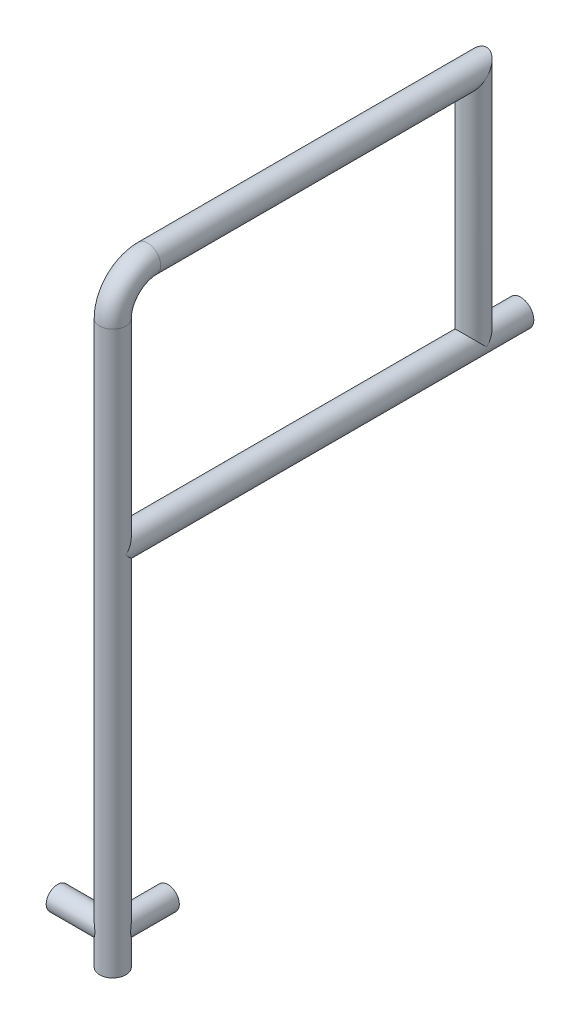
ISO-10303-21;
HEADER;
FILE_DESCRIPTION(('STEP AP214'),'2;1');
FILE_NAME('part.step','',(''),(''),'','','');
FILE_SCHEMA(('AUTOMOTIVE_DESIGN { 1 0 10303 214 1 1 1 1 }'));
ENDSEC;
DATA;
#1=APPLICATION_CONTEXT('core data for automotive mechanical design processes');
#2=APPLICATION_PROTOCOL_DEFINITION('international standard','automotive_design',2000,#1);
#3=PRODUCT_CONTEXT('',#1,'mechanical');
#4=PRODUCT('Part','Part','',(#3));
#5=PRODUCT_RELATED_PRODUCT_CATEGORY('part','',(#4));
#6=PRODUCT_DEFINITION_FORMATION('','',#4);
#7=PRODUCT_DEFINITION_CONTEXT('part definition',#1,'design');
#8=PRODUCT_DEFINITION('design','',#6,#7);
#9=PRODUCT_DEFINITION_SHAPE('','',#8);
#10=(LENGTH_UNIT() NAMED_UNIT(*) SI_UNIT(.MILLI.,.METRE.));
#11=(NAMED_UNIT(*) PLANE_ANGLE_UNIT() SI_UNIT($,.RADIAN.));
#12=(NAMED_UNIT(*) SI_UNIT($,.STERADIAN.) SOLID_ANGLE_UNIT());
#13=UNCERTAINTY_MEASURE_WITH_UNIT(LENGTH_MEASURE(1.E-05),#10,'distance_accuracy_value','');
#14=(GEOMETRIC_REPRESENTATION_CONTEXT(3) GLOBAL_UNCERTAINTY_ASSIGNED_CONTEXT((#13)) GLOBAL_UNIT_ASSIGNED_CONTEXT((#10,
#11,#12)) REPRESENTATION_CONTEXT('',''));
#15=CARTESIAN_POINT('',(0.,0.,0.));
#16=DIRECTION('',(0.,0.,1.));
#17=DIRECTION('',(1.,0.,0.));
#18=AXIS2_PLACEMENT_3D('',#15,#16,#17);
#19=CARTESIAN_POINT('',(0.,378.064321521951,-550.094321521951));
#20=DIRECTION('',(0.,-1.,0.));
#21=DIRECTION('',(0.,0.,-1.));
#22=AXIS2_PLACEMENT_3D('',#19,#20,#21);
#23=CYLINDRICAL_SURFACE('',#22,20.);
#24=CARTESIAN_POINT('',(0.,0.,-550.094321521951));
#25=DIRECTION('',(0.,-0.707106781186548,0.707106781186547));
#26=DIRECTION('',(0.,-0.707106781186547,-0.707106781186548));
#27=AXIS2_PLACEMENT_3D('',#24,#25,#26);
#28=ELLIPSE('',#27,28.2842712474619,20.);
#29=CARTESIAN_POINT('',(19.9997775850257,0.0943215219507132,-550.));
#30=VERTEX_POINT('',#29);
#31=CARTESIAN_POINT('',(-19.9997775850257,0.0943215219507132,-550.));
#32=VERTEX_POINT('',#31);
#33=EDGE_CURVE('E137',#30,#32,#28,.T.);
#34=ORIENTED_EDGE('',*,*,#33,.F.);
#35=DIRECTION('',(0.,0.,1.));
#36=VECTOR('',#35,1.);
#37=CARTESIAN_POINT('',(19.9997775850257,0.0943215219507415,-622.));
#38=LINE('',#37,#36);
#39=CARTESIAN_POINT('',(19.9997775850257,0.0943215219507132,-550.188643043902));
#40=VERTEX_POINT('',#39);
#41=EDGE_CURVE('E132',#40,#30,#38,.T.);
#42=ORIENTED_EDGE('',*,*,#41,.F.);
#43=CARTESIAN_POINT('',(0.,0.,-550.094321521951));
#44=DIRECTION('',(0.,-0.707106781186547,-0.707106781186548));
#45=DIRECTION('',(0.,-0.707106781186548,0.707106781186547));
#46=AXIS2_PLACEMENT_3D('',#43,#44,#45);
#47=ELLIPSE('',#46,28.2842712474619,20.);
#48=CARTESIAN_POINT('',(-19.9997775850257,0.0943215219507132,-550.188643043902));
#49=VERTEX_POINT('',#48);
#50=EDGE_CURVE('E64',#49,#40,#47,.T.);
#51=ORIENTED_EDGE('',*,*,#50,.F.);
#52=DIRECTION('',(0.,0.,1.));
#53=VECTOR('',#52,1.);
#54=CARTESIAN_POINT('',(-19.9997775850257,0.0943215219507415,-622.));
#55=LINE('',#54,#53);
#56=EDGE_CURVE('E138',#32,#49,#55,.F.);
#57=ORIENTED_EDGE('',*,*,#56,.F.);
#58=EDGE_LOOP('',(#34,#42,#51,#57));
#59=FACE_BOUND('',#58,.T.);
#60=CARTESIAN_POINT('',(0.,355.964321521951,-550.094321521951));
#61=DIRECTION('',(0.,-0.707106781186547,-0.707106781186547));
#62=DIRECTION('',(0.,0.707106781186548,-0.707106781186548));
#63=AXIS2_PLACEMENT_3D('',#60,#61,#62);
#64=ELLIPSE('',#63,28.2842712474619,20.);
#65=CARTESIAN_POINT('',(0.,375.964321521951,-570.094321521951));
#66=VERTEX_POINT('',#65);
#67=EDGE_CURVE('E203',#66,#66,#64,.F.);
#68=ORIENTED_EDGE('',*,*,#67,.F.);
#69=EDGE_LOOP('',(#68));
#70=FACE_BOUND('',#69,.T.);
#71=ADVANCED_FACE('F43',(#59,#70),#23,.T.);
#72=CARTESIAN_POINT('',(0.,0.,0.));
#73=DIRECTION('',(0.,1.,0.));
#74=DIRECTION('',(0.,0.,1.));
#75=AXIS2_PLACEMENT_3D('',#72,#73,#74);
#76=CYLINDRICAL_SURFACE('',#75,20.);
#77=CARTESIAN_POINT('',(-9.68245836551853,-503.90605298,-17.5));
#78=CARTESIAN_POINT('',(-9.68246231795958,-504.187638009203,-17.4999987045085));
#79=CARTESIAN_POINT('',(-9.69480918943084,-504.469242415254,-17.493183750782));
#80=CARTESIAN_POINT('',(-9.74343813489293,-505.029712400521,-17.4661432014171));
#81=CARTESIAN_POINT('',(-9.77972336892798,-505.308577613209,-17.4459158352374));
#82=CARTESIAN_POINT('',(-9.87426328854648,-505.86197922257,-17.3925802335263));
#83=CARTESIAN_POINT('',(-9.93257330136768,-506.136502888467,-17.3594395524864));
#84=CARTESIAN_POINT('',(-10.0682929552098,-506.679066974342,-17.2810764516704));
#85=CARTESIAN_POINT('',(-10.1457112063541,-506.947104411692,-17.2358485846765));
#86=CARTESIAN_POINT('',(-10.3543761638166,-507.592997294864,-17.1116158332259));
#87=CARTESIAN_POINT('',(-10.4942738051237,-507.966884340313,-17.0265244282843));
#88=CARTESIAN_POINT('',(-10.7986160705714,-508.698873939867,-16.835147722142));
#89=CARTESIAN_POINT('',(-10.9630748290121,-509.05696725036,-16.7288502054552));
#90=CARTESIAN_POINT('',(-11.3099122851878,-509.759045089837,-16.4963517580476));
#91=CARTESIAN_POINT('',(-11.4923444346771,-510.102982941877,-16.3700907398646));
#92=CARTESIAN_POINT('',(-11.8691327091975,-510.776586977339,-16.0989927963247));
#93=CARTESIAN_POINT('',(-12.0634878401741,-511.106254346635,-15.9541574184724));
#94=CARTESIAN_POINT('',(-12.4192960222625,-511.686154489637,-15.6780399234265));
#95=CARTESIAN_POINT('',(-12.5793409858103,-511.938834657242,-15.5500516306426));
#96=CARTESIAN_POINT('',(-12.9025933017771,-512.43615073305,-15.2829019251943));
#97=CARTESIAN_POINT('',(-13.065800967815,-512.680785836935,-15.1437394001281));
#98=CARTESIAN_POINT('',(-13.5580665641397,-513.403209717864,-14.7095234796256));
#99=CARTESIAN_POINT('',(-13.8896847405041,-513.869385708831,-14.3978045379539));
#100=CARTESIAN_POINT('',(-14.5496844312408,-514.770531463886,-13.7305135891895));
#101=CARTESIAN_POINT('',(-14.878068960753,-515.205533269556,-13.3749876608545));
#102=CARTESIAN_POINT('',(-15.5240744357728,-516.043516244562,-12.6194286054934));
#103=CARTESIAN_POINT('',(-15.8417001432422,-516.446511689313,-12.2194155138144));
#104=CARTESIAN_POINT('',(-16.3876744815375,-517.128659549576,-11.471973798996));
#105=CARTESIAN_POINT('',(-16.619711347584,-517.41493070967,-11.1337109016367));
#106=CARTESIAN_POINT('',(-17.0698056319617,-517.964974479015,-10.4305290731242));
#107=CARTESIAN_POINT('',(-17.2878634246317,-518.22874769079,-10.0656108563211));
#108=CARTESIAN_POINT('',(-17.706227397409,-518.73102357124,-9.30998224050817));
#109=CARTESIAN_POINT('',(-17.9065576451303,-518.969560590409,-8.91930810724853));
#110=CARTESIAN_POINT('',(-18.2861816709093,-519.418914990599,-8.11259198784253));
#111=CARTESIAN_POINT('',(-18.4654796998659,-519.629737974048,-7.69655515376672));
#112=CARTESIAN_POINT('',(-18.7680937292758,-519.983930199969,-6.9208446503503));
#113=CARTESIAN_POINT('',(-18.8956068534805,-520.132539332453,-6.56519415452418));
#114=CARTESIAN_POINT('',(-19.1323128930904,-520.407577264458,-5.83953557962174));
#115=CARTESIAN_POINT('',(-19.2415095615515,-520.534010608058,-5.46953046099681));
#116=CARTESIAN_POINT('',(-19.4396771962977,-520.762930860696,-4.71701905550166));
#117=CARTESIAN_POINT('',(-19.5286551275903,-520.865426016367,-4.33451712566136));
#118=CARTESIAN_POINT('',(-19.6847333854608,-521.044918001859,-3.55916144167617));
#119=CARTESIAN_POINT('',(-19.7518334706815,-521.121914550378,-3.16630757337998));
#120=CARTESIAN_POINT('',(-19.8630552241249,-521.249407349046,-2.37089370722918));
#121=CARTESIAN_POINT('',(-19.9070523449014,-521.299759973523,-1.96829309755187));
#122=CARTESIAN_POINT('',(-19.9705396287186,-521.372385309669,-1.15863165139295));
#123=CARTESIAN_POINT('',(-19.9900297363705,-521.394657957872,-0.751570804832758));
#124=CARTESIAN_POINT('',(-20.0040514912821,-521.410683537615,0.0634815918555094));
#125=CARTESIAN_POINT('',(-19.9985868727677,-521.404440736207,0.471472993603273));
#126=CARTESIAN_POINT('',(-19.9628332349748,-521.36356740107,1.28491619288903));
#127=CARTESIAN_POINT('',(-19.9325455339593,-521.328938374831,1.69036812413687));
#128=CARTESIAN_POINT('',(-19.8514602849104,-521.236111694214,2.46102432415966));
#129=CARTESIAN_POINT('',(-19.8026311439351,-521.18017473292,2.82671325593868));
#130=CARTESIAN_POINT('',(-19.6856876965186,-521.045988309111,3.55079998638595));
#131=CARTESIAN_POINT('',(-19.6175747297336,-520.967740396545,3.90919828968438));
#132=CARTESIAN_POINT('',(-19.4632241291768,-520.79004039036,4.6167128384262));
#133=CARTESIAN_POINT('',(-19.3769851664396,-520.690586741965,4.96582840116043));
#134=CARTESIAN_POINT('',(-19.1877471482241,-520.471760274158,5.65308969352245));
#135=CARTESIAN_POINT('',(-19.0847470590452,-520.352386226193,5.9912347450278));
#136=CARTESIAN_POINT('',(-18.8559373813998,-520.086327834972,6.67782328162181));
#137=CARTESIAN_POINT('',(-18.7290524867206,-519.938337706903,7.025401314757));
#138=CARTESIAN_POINT('',(-18.4597362362003,-519.62287858202,7.70531466659122));
#139=CARTESIAN_POINT('',(-18.3173046107312,-519.455409247374,8.03764972078829));
#140=CARTESIAN_POINT('',(-18.0187205249018,-519.102537449897,8.68638320773241));
#141=CARTESIAN_POINT('',(-17.8625634014242,-518.917128890198,9.00277616640959));
#142=CARTESIAN_POINT('',(-17.5383965882113,-518.529888376958,9.61903985229933));
#143=CARTESIAN_POINT('',(-17.3703844466225,-518.328053024697,9.91890713869959));
#144=CARTESIAN_POINT('',(-16.9348626834331,-517.801075409445,10.6524472151173));
#145=CARTESIAN_POINT('',(-16.6607909760939,-517.4660976938,11.0752167304357));
#146=CARTESIAN_POINT('',(-16.0954431497884,-516.765146673167,11.8818982022431));
#147=CARTESIAN_POINT('',(-15.8041591099174,-516.399159063661,12.2657920446021));
#148=CARTESIAN_POINT('',(-15.2095597193117,-515.637949607916,12.9958240083843));
#149=CARTESIAN_POINT('',(-14.9062148361666,-515.242653654607,13.3418605372673));
#150=CARTESIAN_POINT('',(-14.2944299438425,-514.425290322128,13.9953365498953));
#151=CARTESIAN_POINT('',(-13.9859913061424,-514.003230064984,14.3027862373238));
#152=CARTESIAN_POINT('',(-13.414122120094,-513.193614825029,14.8388897116663));
#153=CARTESIAN_POINT('',(-13.1504504526446,-512.809531032022,15.0725463028032));
#154=CARTESIAN_POINT('',(-12.6297963642774,-512.020833533775,15.5114180261908));
#155=CARTESIAN_POINT('',(-12.3728158168734,-511.616214170145,15.7166252607194));
#156=CARTESIAN_POINT('',(-11.8734123320219,-510.7862851887,16.0972148337801));
#157=CARTESIAN_POINT('',(-11.6309504806044,-510.361036968866,16.2726794391511));
#158=CARTESIAN_POINT('',(-11.1695243163615,-509.48691756489,16.5927788632844));
#159=CARTESIAN_POINT('',(-10.950539614174,-509.038067391895,16.7374405431509));
#160=CARTESIAN_POINT('',(-10.6432351030576,-508.330672621171,16.9333325052445));
#161=CARTESIAN_POINT('',(-10.5416678184595,-508.081190694221,16.9966377344709));
#162=CARTESIAN_POINT('',(-10.3515787409943,-507.5748780262,17.1130712677551));
#163=CARTESIAN_POINT('',(-10.2630585408289,-507.318046392489,17.1661983295665));
#164=CARTESIAN_POINT('',(-10.1020785938894,-506.797932264893,17.2614241472653));
#165=CARTESIAN_POINT('',(-10.0295864682285,-506.534663991926,17.3035451687485));
#166=CARTESIAN_POINT('',(-9.90337736681871,-506.002169182628,17.3760879435573));
#167=CARTESIAN_POINT('',(-9.84965027453365,-505.732945940225,17.4065160016406));
#168=CARTESIAN_POINT('',(-9.76296098654506,-505.186334195269,17.4552894705277));
#169=CARTESIAN_POINT('',(-9.73028436319781,-504.90888472239,17.4734688604364));
#170=CARTESIAN_POINT('',(-9.68872595593487,-504.351655489637,17.4965474138236));
#171=CARTESIAN_POINT('',(-9.6798418075734,-504.07187596409,17.5014478969323));
#172=CARTESIAN_POINT('',(-9.68641226122006,-503.512641200022,17.4978121429925));
#173=CARTESIAN_POINT('',(-9.70187142678451,-503.233186032135,17.4892733865369));
#174=CARTESIAN_POINT('',(-9.75619132077278,-502.677287535776,17.4590283498962));
#175=CARTESIAN_POINT('',(-9.79505568388823,-502.400844681888,17.4373200245495));
#176=CARTESIAN_POINT('',(-9.90030505749486,-501.818434768071,17.3778033249474));
#177=CARTESIAN_POINT('',(-9.96955210665191,-501.513162538779,17.3383041208272));
#178=CARTESIAN_POINT('',(-10.1309144356563,-500.911109415025,17.2445130686978));
#179=CARTESIAN_POINT('',(-10.2230350001972,-500.614330500555,17.1902178019256));
#180=CARTESIAN_POINT('',(-10.426121477896,-500.029256488622,17.0678080717346));
#181=CARTESIAN_POINT('',(-10.5371444826998,-499.740990292605,16.9996516179019));
#182=CARTESIAN_POINT('',(-10.7739055865237,-499.173877046099,16.8505942445724));
#183=CARTESIAN_POINT('',(-10.8996499520537,-498.895034072398,16.7696878926591));
#184=CARTESIAN_POINT('',(-11.145416053778,-498.382086952647,16.6071825156515));
#185=CARTESIAN_POINT('',(-11.2640727087571,-498.146862731782,16.5270279124971));
#186=CARTESIAN_POINT('',(-11.508059368069,-497.683173317455,16.3580751079654));
#187=CARTESIAN_POINT('',(-11.633388038846,-497.45470678741,16.2692786309489));
#188=CARTESIAN_POINT('',(-12.0172011374973,-496.778541945638,15.990206903609));
#189=CARTESIAN_POINT('',(-12.2833802803912,-496.340346132694,15.7873351129922));
#190=CARTESIAN_POINT('',(-12.8267404765426,-495.486824303244,15.3491681676132));
#191=CARTESIAN_POINT('',(-13.1039367160035,-495.071531881387,15.1138270691917));
#192=CARTESIAN_POINT('',(-13.6618803280395,-494.263318815564,14.6114321896762));
#193=CARTESIAN_POINT('',(-13.9426267587902,-493.870392384259,14.3443866679908));
#194=CARTESIAN_POINT('',(-14.5234398651412,-493.077453813111,13.7569296300854));
#195=CARTESIAN_POINT('',(-14.8233476898615,-492.679185307141,13.4340017148748));
#196=CARTESIAN_POINT('',(-15.4148615624592,-491.909025658326,12.7509309998255));
#197=CARTESIAN_POINT('',(-15.7064660723357,-491.53713938341,12.3907813619679));
#198=CARTESIAN_POINT('',(-16.2751429427536,-490.822593099614,11.6337204129121));
#199=CARTESIAN_POINT('',(-16.5522431410083,-490.47987625061,11.2368838937111));
#200=CARTESIAN_POINT('',(-17.0869029944246,-489.826009453746,10.4058480823507));
#201=CARTESIAN_POINT('',(-17.344469741004,-489.514848036043,9.9716624727545));
#202=CARTESIAN_POINT('',(-17.7712631721112,-489.003632974557,9.18304429114006));
#203=CARTESIAN_POINT('',(-17.9461673608626,-488.795591906182,8.8368378186363));
#204=CARTESIAN_POINT('',(-18.2795514953357,-488.401114225544,8.1248040060286));
#205=CARTESIAN_POINT('',(-18.4380354747463,-488.21467230603,7.75898151834492));
#206=CARTESIAN_POINT('',(-18.7360469717587,-487.865550544654,7.00880756318526));
#207=CARTESIAN_POINT('',(-18.8755789185479,-487.702865150101,6.62446045355501));
#208=CARTESIAN_POINT('',(-19.1332092453521,-487.403461845191,5.83876634816048));
#209=CARTESIAN_POINT('',(-19.2513072615778,-487.266744375576,5.43741906400185));
#210=CARTESIAN_POINT('',(-19.4646008627409,-487.020422475996,4.61635990334318));
#211=CARTESIAN_POINT('',(-19.5595831080311,-486.911070362816,4.19651630384061));
#212=CARTESIAN_POINT('',(-19.7230737390982,-486.723160751471,3.34489411006681));
#213=CARTESIAN_POINT('',(-19.79158202912,-486.64460336469,2.91311547263312));
#214=CARTESIAN_POINT('',(-19.9003562197097,-486.519992411348,2.04168403638287));
#215=CARTESIAN_POINT('',(-19.9406428972317,-486.473914932689,1.60203727520823));
#216=CARTESIAN_POINT('',(-19.9919694764988,-486.415225360157,0.718839505700231));
#217=CARTESIAN_POINT('',(-20.0030134345039,-486.402608624942,0.275289047413589));
#218=CARTESIAN_POINT('',(-19.9960767606155,-486.410537062337,-0.551522796600817));
#219=CARTESIAN_POINT('',(-19.9818010524998,-486.426849164909,-0.93486707439047));
#220=CARTESIAN_POINT('',(-19.9314420569356,-486.484440536551,-1.69819663461642));
#221=CARTESIAN_POINT('',(-19.8953611095413,-486.525717126528,-2.07818227304984));
#222=CARTESIAN_POINT('',(-19.8021108897347,-486.632539362998,-2.83208420729457));
#223=CARTESIAN_POINT('',(-19.7449413679669,-486.698085296455,-3.20600043128531));
#224=CARTESIAN_POINT('',(-19.6105964335527,-486.852404302861,-3.94533820947789));
#225=CARTESIAN_POINT('',(-19.5334201843569,-486.941178347056,-4.31075940777745));
#226=CARTESIAN_POINT('',(-19.3611707540315,-487.139796525061,-5.0279131700227));
#227=CARTESIAN_POINT('',(-19.2662573524069,-487.24945270473,-5.3797364904668));
#228=CARTESIAN_POINT('',(-19.0596211609535,-487.488902880979,-6.07133490822705));
#229=CARTESIAN_POINT('',(-18.9478990115318,-487.618696110351,-6.41111046394946));
#230=CARTESIAN_POINT('',(-18.7092190635448,-487.896992993497,-7.07745722468961));
#231=CARTESIAN_POINT('',(-18.5822578142968,-488.045500885329,-7.40402541661729));
#232=CARTESIAN_POINT('',(-18.3147474221613,-488.359774680367,-8.04301328355597));
#233=CARTESIAN_POINT('',(-18.1741954866046,-488.525544131089,-8.35543003122141));
#234=CARTESIAN_POINT('',(-17.8145907293151,-488.951853016445,-9.1039743624599));
#235=CARTESIAN_POINT('',(-17.5888636641035,-489.221255785161,-9.53188835109634));
#236=CARTESIAN_POINT('',(-17.1169593153222,-489.789910108647,-10.3554405658837));
#237=CARTESIAN_POINT('',(-16.8707741019663,-490.089173246706,-10.7510661578432));
#238=CARTESIAN_POINT('',(-16.3621198901788,-490.715058983897,-11.5104422744364));
#239=CARTESIAN_POINT('',(-16.0996180560313,-491.04173724824,-11.8741247202074));
#240=CARTESIAN_POINT('',(-15.5633771594029,-491.719515113706,-12.5687624660778));
#241=CARTESIAN_POINT('',(-15.2896395019522,-492.070611665131,-12.8997218406326));
#242=CARTESIAN_POINT('',(-14.7298731646199,-492.803073109047,-13.5356508566245));
#243=CARTESIAN_POINT('',(-14.4437078646564,-493.184906651098,-13.8399592593223));
#244=CARTESIAN_POINT('',(-13.8696125016716,-493.971834141318,-14.4152330038578));
#245=CARTESIAN_POINT('',(-13.5816820536671,-494.376933337607,-14.6861907790018));
#246=CARTESIAN_POINT('',(-13.010637513981,-495.210149718194,-15.1943805053081));
#247=CARTESIAN_POINT('',(-12.7275183680389,-495.638240492993,-15.4316500572476));
#248=CARTESIAN_POINT('',(-12.1737010959011,-496.519130386944,-15.8721719066567));
#249=CARTESIAN_POINT('',(-11.9029964865827,-496.971916332954,-16.0754421095446));
#250=CARTESIAN_POINT('',(-11.49345720717,-497.709276540424,-16.3687173904552));
#251=CARTESIAN_POINT('',(-11.3468698043643,-497.98489421638,-16.4705088954274));
#252=CARTESIAN_POINT('',(-11.0645018507486,-498.545829762428,-16.6615061443608));
#253=CARTESIAN_POINT('',(-10.9287183931754,-498.831144993743,-16.7507152785887));
#254=CARTESIAN_POINT('',(-10.6716024645332,-499.411537715271,-16.9156795216673));
#255=CARTESIAN_POINT('',(-10.5502496267717,-499.706600677473,-16.9914536680585));
#256=CARTESIAN_POINT('',(-10.3259964141428,-500.306938183144,-17.1286628505161));
#257=CARTESIAN_POINT('',(-10.2230908662448,-500.612209835287,-17.1901019079224));
#258=CARTESIAN_POINT('',(-10.0610540433443,-501.16242940612,-17.2853099639157));
#259=CARTESIAN_POINT('',(-9.99728404588865,-501.405468891271,-17.3221943738273));
#260=CARTESIAN_POINT('',(-9.8859113974438,-501.896486181039,-17.3859968639092));
#261=CARTESIAN_POINT('',(-9.83830368832159,-502.14446241489,-17.412918062394));
#262=CARTESIAN_POINT('',(-9.76129389812737,-502.64370143014,-17.4562054479926));
#263=CARTESIAN_POINT('',(-9.73185822000436,-502.894957264168,-17.4725911158865));
#264=CARTESIAN_POINT('',(-9.69243828492372,-503.399487778813,-17.4944891931898));
#265=CARTESIAN_POINT('',(-9.68245481023175,-503.652762540209,-17.5000011653163));
#266=CARTESIAN_POINT('',(-9.68245836551853,-503.90605298,-17.5));
#267=B_SPLINE_CURVE_WITH_KNOTS('',3,(#77,#78,#79,#80,#81,#82,#83,#84,#85,#86,#87,#88,#89,#90,
#91,#92,#93,#94,#95,#96,#97,#98,#99,#100,#101,#102,#103,#104,#105,#106,#107,#108,#109,#110,#111,
#112,#113,#114,#115,#116,#117,#118,#119,#120,#121,#122,#123,#124,#125,#126,#127,#128,#129,#130,
#131,#132,#133,#134,#135,#136,#137,#138,#139,#140,#141,#142,#143,#144,#145,#146,#147,#148,#149,
#150,#151,#152,#153,#154,#155,#156,#157,#158,#159,#160,#161,#162,#163,#164,#165,#166,#167,#168,
#169,#170,#171,#172,#173,#174,#175,#176,#177,#178,#179,#180,#181,#182,#183,#184,#185,#186,#187,
#188,#189,#190,#191,#192,#193,#194,#195,#196,#197,#198,#199,#200,#201,#202,#203,#204,#205,#206,
#207,#208,#209,#210,#211,#212,#213,#214,#215,#216,#217,#218,#219,#220,#221,#222,#223,#224,#225,
#226,#227,#228,#229,#230,#231,#232,#233,#234,#235,#236,#237,#238,#239,#240,#241,#242,#243,#244,
#245,#246,#247,#248,#249,#250,#251,#252,#253,#254,#255,#256,#257,#258,#259,#260,#261,#262,#263,
#264,#265,#266),.UNSPECIFIED.,.T.,.F.,(4,2,2,2,2,2,2,2,2,2,2,2,2,2,2,2,2,2,2,2,2,2,2,2,2,2,2,2,
2,2,2,2,2,2,2,2,2,2,2,2,2,2,2,2,2,2,2,2,2,2,2,2,2,2,2,2,2,2,2,2,2,2,2,2,2,2,2,2,2,2,2,2,2,2,2,2,
2,2,2,2,2,2,2,2,2,2,2,2,2,2,2,2,2,2,4),(0.,0.844447348855803,1.68900619343504,2.53570087187167,
3.38277776751629,4.60521386836723,5.82835618043759,7.05525263874213,8.28204694569044,
9.25773598830635,10.2335222820803,12.1855950795112,14.1356318252152,16.0847938770524,
17.5841768963533,19.0835197476246,20.5807947596338,22.077766628575,23.2945832448504,
24.5111502290907,25.7272974894219,26.9434581658804,28.166109511617,29.3887636206881,
30.6112347777571,31.8336410180613,32.9518454663099,34.0699722514278,35.188181044192,
36.3064588258381,37.5008472237707,38.6952563393501,39.8900728251205,41.0851371511227,
42.8975713540966,44.71084621263,46.528873554344,48.3464191298366,49.9088676293688,
51.471749009699,53.0302343751229,54.5873550762648,55.416987035205,56.2467201863972,
57.0747615303507,57.9023557721026,58.7409531185224,59.5794671238206,60.4181383411354,
61.2569398328303,62.2019727672853,63.1472242454997,64.0953830575369,65.0439469543564,
65.8697638349125,66.6954162721954,68.3476501697795,70.0022464038744,71.6564125363883,
73.4366906864781,75.2172964755623,76.9943490678951,78.7707534002673,80.0900636738466,
81.409049081404,82.727725702949,84.046424703755,85.376868218913,86.7073165461829,
88.0367843555126,89.3660677445915,90.5165163740823,91.6668415637831,92.8171803555992,
93.9675672547518,95.1080513760503,96.2484920563185,97.3891914624533,98.5301257642416,
100.188931696167,101.848383624288,103.511290533535,105.173990127436,106.870326993518,
108.567048023084,110.261860131013,111.955776853396,112.940377948194,113.924713237479,
114.907642366028,115.890295426722,116.651508996311,117.412484117202,118.172048075373,
118.931642578595),.UNSPECIFIED.);
#268=CARTESIAN_POINT('',(-14.142135623731,-514.213817044044,-14.1421356237309));
#269=VERTEX_POINT('',#268);
#270=CARTESIAN_POINT('',(-14.142135623731,-493.598288915956,-14.1421356237309));
#271=VERTEX_POINT('',#270);
#272=EDGE_CURVE('E90',#269,#271,#267,.T.);
#273=ORIENTED_EDGE('',*,*,#272,.F.);
#274=CARTESIAN_POINT('',(17.5,-503.90605298,-9.68245836551853));
#275=CARTESIAN_POINT('',(17.4999987045085,-504.187638009203,-9.68246231795957));
#276=CARTESIAN_POINT('',(17.493183750782,-504.469242415254,-9.69480918943084));
#277=CARTESIAN_POINT('',(17.4661432014171,-505.029712400521,-9.74343813489292));
#278=CARTESIAN_POINT('',(17.4459158352374,-505.308577613209,-9.77972336892797));
#279=CARTESIAN_POINT('',(17.3925802335263,-505.86197922257,-9.87426328854648));
#280=CARTESIAN_POINT('',(17.3594395524864,-506.136502888467,-9.93257330136768));
#281=CARTESIAN_POINT('',(17.2810764516704,-506.679066974342,-10.0682929552098));
#282=CARTESIAN_POINT('',(17.2358485846765,-506.947104411692,-10.1457112063541));
#283=CARTESIAN_POINT('',(17.111615833226,-507.592997294864,-10.3543761638166));
#284=CARTESIAN_POINT('',(17.0265244282843,-507.966884340313,-10.4942738051237));
#285=CARTESIAN_POINT('',(16.835147722142,-508.698873939867,-10.7986160705714));
#286=CARTESIAN_POINT('',(16.7288502054552,-509.05696725036,-10.9630748290121));
#287=CARTESIAN_POINT('',(16.4963517580476,-509.759045089837,-11.3099122851878));
#288=CARTESIAN_POINT('',(16.3700907398646,-510.102982941877,-11.4923444346771));
#289=CARTESIAN_POINT('',(16.0989927963247,-510.776586977339,-11.8691327091975));
#290=CARTESIAN_POINT('',(15.9541574184724,-511.106254346635,-12.0634878401741));
#291=CARTESIAN_POINT('',(15.6780399234265,-511.686154489637,-12.4192960222625));
#292=CARTESIAN_POINT('',(15.5500516306426,-511.938834657242,-12.5793409858103));
#293=CARTESIAN_POINT('',(15.2829019251943,-512.43615073305,-12.9025933017771));
#294=CARTESIAN_POINT('',(15.1437394001281,-512.680785836935,-13.065800967815));
#295=CARTESIAN_POINT('',(14.7095234796256,-513.403209717864,-13.5580665641397));
#296=CARTESIAN_POINT('',(14.3978045379539,-513.869385708831,-13.8896847405041));
#297=CARTESIAN_POINT('',(13.7305135891895,-514.770531463886,-14.5496844312408));
#298=CARTESIAN_POINT('',(13.3749876608545,-515.205533269556,-14.878068960753));
#299=CARTESIAN_POINT('',(12.6194286054934,-516.043516244562,-15.5240744357728));
#300=CARTESIAN_POINT('',(12.2194155138144,-516.446511689313,-15.8417001432422));
#301=CARTESIAN_POINT('',(11.471973798996,-517.128659549576,-16.3876744815375));
#302=CARTESIAN_POINT('',(11.1337109016367,-517.41493070967,-16.619711347584));
#303=CARTESIAN_POINT('',(10.4305290731242,-517.964974479015,-17.0698056319617));
#304=CARTESIAN_POINT('',(10.0656108563211,-518.22874769079,-17.2878634246317));
#305=CARTESIAN_POINT('',(9.30998224050813,-518.73102357124,-17.7062273974091));
#306=CARTESIAN_POINT('',(8.91930810724849,-518.969560590409,-17.9065576451303));
#307=CARTESIAN_POINT('',(8.11259198784246,-519.418914990599,-18.2861816709093));
#308=CARTESIAN_POINT('',(7.69655515376662,-519.629737974048,-18.4654796998659));
#309=CARTESIAN_POINT('',(6.92084465035019,-519.983930199969,-18.7680937292759));
#310=CARTESIAN_POINT('',(6.56519415452409,-520.132539332453,-18.8956068534806));
#311=CARTESIAN_POINT('',(5.83953557962164,-520.407577264458,-19.1323128930905));
#312=CARTESIAN_POINT('',(5.46953046099668,-520.534010608058,-19.2415095615516));
#313=CARTESIAN_POINT('',(4.71701905550151,-520.762930860696,-19.4396771962977));
#314=CARTESIAN_POINT('',(4.33451712566122,-520.865426016367,-19.5286551275904));
#315=CARTESIAN_POINT('',(3.55916144167601,-521.044918001859,-19.6847333854609));
#316=CARTESIAN_POINT('',(3.1663075733798,-521.121914550378,-19.7518334706816));
#317=CARTESIAN_POINT('',(2.37089370722899,-521.249407349046,-19.8630552241249));
#318=CARTESIAN_POINT('',(1.96829309755169,-521.299759973523,-19.9070523449014));
#319=CARTESIAN_POINT('',(1.15863165139277,-521.372385309669,-19.9705396287186));
#320=CARTESIAN_POINT('',(0.751570804832583,-521.394657957872,-19.9900297363705));
#321=CARTESIAN_POINT('',(-0.0634815918556769,-521.410683537615,-20.0040514912821));
#322=CARTESIAN_POINT('',(-0.471472993603435,-521.404440736207,-19.9985868727677));
#323=CARTESIAN_POINT('',(-1.28491619288919,-521.36356740107,-19.9628332349748));
#324=CARTESIAN_POINT('',(-1.69036812413703,-521.328938374831,-19.9325455339593));
#325=CARTESIAN_POINT('',(-2.46102432415981,-521.236111694214,-19.8514602849103));
#326=CARTESIAN_POINT('',(-2.82671325593881,-521.18017473292,-19.8026311439351));
#327=CARTESIAN_POINT('',(-3.55079998638608,-521.045988309111,-19.6856876965186));
#328=CARTESIAN_POINT('',(-3.90919828968452,-520.967740396545,-19.6175747297336));
#329=CARTESIAN_POINT('',(-4.61671283842633,-520.79004039036,-19.4632241291767));
#330=CARTESIAN_POINT('',(-4.96582840116055,-520.690586741965,-19.3769851664396));
#331=CARTESIAN_POINT('',(-5.65308969352257,-520.471760274158,-19.1877471482241));
#332=CARTESIAN_POINT('',(-5.99123474502793,-520.352386226193,-19.0847470590451));
#333=CARTESIAN_POINT('',(-6.67782328162193,-520.086327834972,-18.8559373813998));
#334=CARTESIAN_POINT('',(-7.02540131475708,-519.938337706903,-18.7290524867206));
#335=CARTESIAN_POINT('',(-7.70531466659131,-519.62287858202,-18.4597362362002));
#336=CARTESIAN_POINT('',(-8.0376497207884,-519.455409247374,-18.3173046107312));
#337=CARTESIAN_POINT('',(-8.68638320773254,-519.102537449897,-18.0187205249018));
#338=CARTESIAN_POINT('',(-9.0027761664097,-518.917128890198,-17.8625634014242));
#339=CARTESIAN_POINT('',(-9.61903985229944,-518.529888376958,-17.5383965882112));
#340=CARTESIAN_POINT('',(-9.91890713869973,-518.328053024697,-17.3703844466224));
#341=CARTESIAN_POINT('',(-10.6524472151174,-517.801075409445,-16.934862683433));
#342=CARTESIAN_POINT('',(-11.0752167304358,-517.466097693799,-16.6607909760938));
#343=CARTESIAN_POINT('',(-11.8818982022431,-516.765146673167,-16.0954431497883));
#344=CARTESIAN_POINT('',(-12.2657920446022,-516.399159063661,-15.8041591099173));
#345=CARTESIAN_POINT('',(-12.9958240083844,-515.637949607916,-15.2095597193116));
#346=CARTESIAN_POINT('',(-13.3418605372674,-515.242653654606,-14.9062148361665));
#347=CARTESIAN_POINT('',(-13.9953365498953,-514.425290322128,-14.2944299438425));
#348=CARTESIAN_POINT('',(-14.3027862373238,-514.003230064984,-13.9859913061424));
#349=CARTESIAN_POINT('',(-14.8388897116663,-513.193614825029,-13.414122120094));
#350=CARTESIAN_POINT('',(-15.0725463028032,-512.809531032022,-13.1504504526447));
#351=CARTESIAN_POINT('',(-15.5114180261908,-512.020833533775,-12.6297963642775));
#352=CARTESIAN_POINT('',(-15.7166252607193,-511.616214170145,-12.3728158168734));
#353=CARTESIAN_POINT('',(-16.0972148337801,-510.7862851887,-11.8734123320219));
#354=CARTESIAN_POINT('',(-16.2726794391511,-510.361036968866,-11.6309504806045));
#355=CARTESIAN_POINT('',(-16.5927788632844,-509.48691756489,-11.1695243163615));
#356=CARTESIAN_POINT('',(-16.7374405431509,-509.038067391895,-10.950539614174));
#357=CARTESIAN_POINT('',(-16.9333325052445,-508.330672621171,-10.6432351030576));
#358=CARTESIAN_POINT('',(-16.9966377344709,-508.081190694221,-10.5416678184596));
#359=CARTESIAN_POINT('',(-17.1130712677551,-507.5748780262,-10.3515787409944));
#360=CARTESIAN_POINT('',(-17.1661983295665,-507.318046392489,-10.2630585408289));
#361=CARTESIAN_POINT('',(-17.2614241472653,-506.797932264893,-10.1020785938895));
#362=CARTESIAN_POINT('',(-17.3035451687484,-506.534663991926,-10.0295864682285));
#363=CARTESIAN_POINT('',(-17.3760879435573,-506.002169182628,-9.90337736681874));
#364=CARTESIAN_POINT('',(-17.4065160016406,-505.732945940225,-9.84965027453367));
#365=CARTESIAN_POINT('',(-17.4552894705277,-505.186334195269,-9.76296098654507));
#366=CARTESIAN_POINT('',(-17.4734688604364,-504.90888472239,-9.73028436319782));
#367=CARTESIAN_POINT('',(-17.4965474138236,-504.351655489637,-9.68872595593486));
#368=CARTESIAN_POINT('',(-17.5014478969323,-504.07187596409,-9.67984180757338));
#369=CARTESIAN_POINT('',(-17.4978121429925,-503.512641200022,-9.68641226122004));
#370=CARTESIAN_POINT('',(-17.4892733865369,-503.233186032135,-9.7018714267845));
#371=CARTESIAN_POINT('',(-17.4590283498962,-502.677287535776,-9.75619132077278));
#372=CARTESIAN_POINT('',(-17.4373200245495,-502.400844681888,-9.79505568388823));
#373=CARTESIAN_POINT('',(-17.3778033249474,-501.818434768071,-9.90030505749485));
#374=CARTESIAN_POINT('',(-17.3383041208272,-501.513162538779,-9.9695521066519));
#375=CARTESIAN_POINT('',(-17.2445130686978,-500.911109415025,-10.1309144356563));
#376=CARTESIAN_POINT('',(-17.1902178019256,-500.614330500555,-10.2230350001972));
#377=CARTESIAN_POINT('',(-17.0678080717346,-500.029256488622,-10.426121477896));
#378=CARTESIAN_POINT('',(-16.9996516179019,-499.740990292605,-10.5371444826998));
#379=CARTESIAN_POINT('',(-16.8505942445724,-499.173877046099,-10.7739055865237));
#380=CARTESIAN_POINT('',(-16.7696878926591,-498.895034072398,-10.8996499520537));
#381=CARTESIAN_POINT('',(-16.6071825156515,-498.382086952647,-11.145416053778));
#382=CARTESIAN_POINT('',(-16.5270279124971,-498.146862731782,-11.2640727087572));
#383=CARTESIAN_POINT('',(-16.3580751079653,-497.683173317455,-11.508059368069));
#384=CARTESIAN_POINT('',(-16.2692786309488,-497.454706787409,-11.633388038846));
#385=CARTESIAN_POINT('',(-15.990206903609,-496.778541945638,-12.0172011374973));
#386=CARTESIAN_POINT('',(-15.7873351129922,-496.340346132694,-12.2833802803912));
#387=CARTESIAN_POINT('',(-15.3491681676132,-495.486824303244,-12.8267404765426));
#388=CARTESIAN_POINT('',(-15.1138270691917,-495.071531881387,-13.1039367160035));
#389=CARTESIAN_POINT('',(-14.6114321896762,-494.263318815564,-13.6618803280395));
#390=CARTESIAN_POINT('',(-14.3443866679908,-493.870392384259,-13.9426267587902));
#391=CARTESIAN_POINT('',(-13.7569296300854,-493.077453813111,-14.5234398651412));
#392=CARTESIAN_POINT('',(-13.4340017148748,-492.679185307141,-14.8233476898615));
#393=CARTESIAN_POINT('',(-12.7509309998255,-491.909025658326,-15.4148615624592));
#394=CARTESIAN_POINT('',(-12.3907813619679,-491.53713938341,-15.7064660723357));
#395=CARTESIAN_POINT('',(-11.6337204129121,-490.822593099614,-16.2751429427536));
#396=CARTESIAN_POINT('',(-11.2368838937111,-490.47987625061,-16.5522431410083));
#397=CARTESIAN_POINT('',(-10.4058480823507,-489.826009453746,-17.0869029944246));
#398=CARTESIAN_POINT('',(-9.9716624727545,-489.514848036043,-17.344469741004));
#399=CARTESIAN_POINT('',(-9.18304429114005,-489.003632974557,-17.7712631721112));
#400=CARTESIAN_POINT('',(-8.83683781863628,-488.795591906182,-17.9461673608626));
#401=CARTESIAN_POINT('',(-8.12480400602857,-488.401114225544,-18.2795514953357));
#402=CARTESIAN_POINT('',(-7.75898151834491,-488.21467230603,-18.4380354747463));
#403=CARTESIAN_POINT('',(-7.00880756318526,-487.865550544654,-18.7360469717587));
#404=CARTESIAN_POINT('',(-6.624460453555,-487.702865150101,-18.8755789185479));
#405=CARTESIAN_POINT('',(-5.83876634816047,-487.403461845191,-19.1332092453521));
#406=CARTESIAN_POINT('',(-5.43741906400184,-487.266744375576,-19.2513072615778));
#407=CARTESIAN_POINT('',(-4.61635990334318,-487.020422475996,-19.4646008627409));
#408=CARTESIAN_POINT('',(-4.19651630384062,-486.911070362816,-19.5595831080311));
#409=CARTESIAN_POINT('',(-3.34489411006682,-486.723160751471,-19.7230737390982));
#410=CARTESIAN_POINT('',(-2.91311547263313,-486.64460336469,-19.79158202912));
#411=CARTESIAN_POINT('',(-2.04168403638288,-486.519992411348,-19.9003562197097));
#412=CARTESIAN_POINT('',(-1.60203727520824,-486.473914932689,-19.9406428972317));
#413=CARTESIAN_POINT('',(-0.718839505700232,-486.415225360157,-19.9919694764988));
#414=CARTESIAN_POINT('',(-0.275289047413588,-486.402608624942,-20.0030134345039));
#415=CARTESIAN_POINT('',(0.551522796600825,-486.410537062337,-19.9960767606155));
#416=CARTESIAN_POINT('',(0.934867074390482,-486.426849164909,-19.9818010524998));
#417=CARTESIAN_POINT('',(1.69819663461644,-486.484440536551,-19.9314420569356));
#418=CARTESIAN_POINT('',(2.07818227304985,-486.525717126528,-19.8953611095413));
#419=CARTESIAN_POINT('',(2.83208420729458,-486.632539362997,-19.8021108897347));
#420=CARTESIAN_POINT('',(3.20600043128532,-486.698085296455,-19.7449413679669));
#421=CARTESIAN_POINT('',(3.9453382094779,-486.852404302861,-19.6105964335527));
#422=CARTESIAN_POINT('',(4.31075940777745,-486.941178347056,-19.5334201843569));
#423=CARTESIAN_POINT('',(5.0279131700227,-487.139796525061,-19.3611707540315));
#424=CARTESIAN_POINT('',(5.3797364904668,-487.24945270473,-19.2662573524069));
#425=CARTESIAN_POINT('',(6.07133490822704,-487.488902880979,-19.0596211609535));
#426=CARTESIAN_POINT('',(6.41111046394945,-487.618696110351,-18.9478990115318));
#427=CARTESIAN_POINT('',(7.07745722468961,-487.896992993497,-18.7092190635448));
#428=CARTESIAN_POINT('',(7.40402541661729,-488.045500885329,-18.5822578142968));
#429=CARTESIAN_POINT('',(8.04301328355597,-488.359774680367,-18.3147474221613));
#430=CARTESIAN_POINT('',(8.35543003122142,-488.525544131089,-18.1741954866046));
#431=CARTESIAN_POINT('',(9.1039743624599,-488.951853016445,-17.8145907293151));
#432=CARTESIAN_POINT('',(9.53188835109635,-489.221255785161,-17.5888636641035));
#433=CARTESIAN_POINT('',(10.3554405658837,-489.789910108647,-17.1169593153222));
#434=CARTESIAN_POINT('',(10.7510661578432,-490.089173246706,-16.8707741019663));
#435=CARTESIAN_POINT('',(11.5104422744364,-490.715058983897,-16.3621198901788));
#436=CARTESIAN_POINT('',(11.8741247202074,-491.04173724824,-16.0996180560313));
#437=CARTESIAN_POINT('',(12.5687624660779,-491.719515113706,-15.5633771594029));
#438=CARTESIAN_POINT('',(12.8997218406326,-492.070611665131,-15.2896395019522));
#439=CARTESIAN_POINT('',(13.5356508566245,-492.803073109047,-14.7298731646199));
#440=CARTESIAN_POINT('',(13.8399592593223,-493.184906651098,-14.4437078646564));
#441=CARTESIAN_POINT('',(14.4152330038578,-493.971834141318,-13.8696125016716));
#442=CARTESIAN_POINT('',(14.6861907790018,-494.376933337607,-13.5816820536671));
#443=CARTESIAN_POINT('',(15.1943805053081,-495.210149718194,-13.010637513981));
#444=CARTESIAN_POINT('',(15.4316500572476,-495.638240492993,-12.7275183680389));
#445=CARTESIAN_POINT('',(15.8721719066567,-496.519130386944,-12.1737010959011));
#446=CARTESIAN_POINT('',(16.0754421095446,-496.971916332954,-11.9029964865827));
#447=CARTESIAN_POINT('',(16.3687173904552,-497.709276540424,-11.49345720717));
#448=CARTESIAN_POINT('',(16.4705088954274,-497.98489421638,-11.3468698043643));
#449=CARTESIAN_POINT('',(16.6615061443608,-498.545829762428,-11.0645018507485));
#450=CARTESIAN_POINT('',(16.7507152785887,-498.831144993743,-10.9287183931754));
#451=CARTESIAN_POINT('',(16.9156795216673,-499.411537715271,-10.6716024645333));
#452=CARTESIAN_POINT('',(16.9914536680585,-499.706600677473,-10.5502496267717));
#453=CARTESIAN_POINT('',(17.1286628505161,-500.306938183144,-10.3259964141428));
#454=CARTESIAN_POINT('',(17.1901019079224,-500.612209835287,-10.2230908662448));
#455=CARTESIAN_POINT('',(17.2853099639157,-501.16242940612,-10.0610540433443));
#456=CARTESIAN_POINT('',(17.3221943738273,-501.405468891271,-9.99728404588864));
#457=CARTESIAN_POINT('',(17.3859968639092,-501.896486181039,-9.8859113974438));
#458=CARTESIAN_POINT('',(17.412918062394,-502.14446241489,-9.83830368832158));
#459=CARTESIAN_POINT('',(17.4562054479926,-502.64370143014,-9.76129389812736));
#460=CARTESIAN_POINT('',(17.4725911158865,-502.894957264168,-9.73185822000436));
#461=CARTESIAN_POINT('',(17.4944891931898,-503.399487778813,-9.69243828492371));
#462=CARTESIAN_POINT('',(17.5000011653163,-503.652762540209,-9.68245481023175));
#463=CARTESIAN_POINT('',(17.5,-503.90605298,-9.68245836551853));
#464=B_SPLINE_CURVE_WITH_KNOTS('',3,(#274,#275,#276,#277,#278,#279,#280,#281,#282,#283,#284,
#285,#286,#287,#288,#289,#290,#291,#292,#293,#294,#295,#296,#297,#298,#299,#300,#301,#302,#303,
#304,#305,#306,#307,#308,#309,#310,#311,#312,#313,#314,#315,#316,#317,#318,#319,#320,#321,#322,
#323,#324,#325,#326,#327,#328,#329,#330,#331,#332,#333,#334,#335,#336,#337,#338,#339,#340,#341,
#342,#343,#344,#345,#346,#347,#348,#349,#350,#351,#352,#353,#354,#355,#356,#357,#358,#359,#360,
#361,#362,#363,#364,#365,#366,#367,#368,#369,#370,#371,#372,#373,#374,#375,#376,#377,#378,#379,
#380,#381,#382,#383,#384,#385,#386,#387,#388,#389,#390,#391,#392,#393,#394,#395,#396,#397,#398,
#399,#400,#401,#402,#403,#404,#405,#406,#407,#408,#409,#410,#411,#412,#413,#414,#415,#416,#417,
#418,#419,#420,#421,#422,#423,#424,#425,#426,#427,#428,#429,#430,#431,#432,#433,#434,#435,#436,
#437,#438,#439,#440,#441,#442,#443,#444,#445,#446,#447,#448,#449,#450,#451,#452,#453,#454,#455,
#456,#457,#458,#459,#460,#461,#462,#463),.UNSPECIFIED.,.T.,.F.,(4,2,2,2,2,2,2,2,2,2,2,2,2,2,2,2,
2,2,2,2,2,2,2,2,2,2,2,2,2,2,2,2,2,2,2,2,2,2,2,2,2,2,2,2,2,2,2,2,2,2,2,2,2,2,2,2,2,2,2,2,2,2,2,2,
2,2,2,2,2,2,2,2,2,2,2,2,2,2,2,2,2,2,2,2,2,2,2,2,2,2,2,2,2,2,4),(0.,0.844447348855803,
1.68900619343504,2.53570087187167,3.38277776751629,4.60521386836723,5.8283561804376,
7.05525263874213,8.28204694569044,9.25773598830635,10.2335222820803,12.1855950795112,
14.1356318252152,16.0847938770524,17.5841768963533,19.0835197476246,20.5807947596339,
22.0777666285752,23.2945832448504,24.5111502290909,25.7272974894221,26.9434581658806,
28.1661095116172,29.3887636206882,30.6112347777572,31.8336410180615,32.95184546631,
34.0699722514279,35.1881810441921,36.3064588258382,37.5008472237708,38.6952563393502,
39.8900728251206,41.085137151123,42.8975713540968,44.7108462126303,46.5288735543441,
48.3464191298366,49.9088676293688,51.4717490096989,53.030234375123,54.5873550762647,
55.4169870352049,56.2467201863971,57.0747615303504,57.9023557721025,58.7409531185223,
59.5794671238206,60.4181383411355,61.2569398328303,62.2019727672853,63.1472242454998,
64.0953830575369,65.0439469543564,65.8697638349127,66.6954162721956,68.3476501697796,
70.0022464038745,71.6564125363884,73.4366906864781,75.2172964755624,76.9943490678952,
78.7707534002673,80.0900636738467,81.4090490814041,82.7277257029491,84.0464247037551,
85.376868218913,86.707316546183,88.0367843555127,89.3660677445915,90.5165163740824,
91.6668415637832,92.8171803555992,93.9675672547518,95.1080513760503,96.2484920563186,
97.3891914624534,98.5301257642417,100.188931696167,101.848383624288,103.511290533536,
105.173990127436,106.870326993518,108.567048023084,110.261860131013,111.955776853397,
112.940377948194,113.924713237479,114.907642366028,115.890295426722,116.651508996312,
117.412484117202,118.172048075373,118.931642578596),.UNSPECIFIED.);
#465=EDGE_CURVE('E52',#271,#269,#464,.T.);
#466=ORIENTED_EDGE('',*,*,#465,.F.);
#467=EDGE_LOOP('',(#273,#466));
#468=FACE_BOUND('',#467,.T.);
#469=CARTESIAN_POINT('',(0.,0.,0.));
#470=DIRECTION('',(0.,0.707106781186547,0.707106781186547));
#471=DIRECTION('',(0.,0.707106781186547,-0.707106781186547));
#472=AXIS2_PLACEMENT_3D('',#469,#470,#471);
#473=ELLIPSE('',#472,28.2842712474619,20.);
#474=CARTESIAN_POINT('',(-20.,0.,0.));
#475=VERTEX_POINT('',#474);
#476=CARTESIAN_POINT('',(20.,0.,0.));
#477=VERTEX_POINT('',#476);
#478=EDGE_CURVE('E89',#475,#477,#473,.F.);
#479=ORIENTED_EDGE('',*,*,#478,.F.);
#480=CARTESIAN_POINT('',(0.,0.,0.));
#481=DIRECTION('',(0.,0.707106781186547,-0.707106781186547));
#482=DIRECTION('',(0.,0.707106781186547,0.707106781186547));
#483=AXIS2_PLACEMENT_3D('',#480,#481,#482);
#484=ELLIPSE('',#483,28.2842712474619,20.);
#485=EDGE_CURVE('E192',#477,#475,#484,.T.);
#486=ORIENTED_EDGE('',*,*,#485,.F.);
#487=EDGE_LOOP('',(#479,#486));
#488=FACE_BOUND('',#487,.T.);
#489=CARTESIAN_POINT('',(0.,302.819820908144,0.));
#490=DIRECTION('',(0.,1.,0.));
#491=DIRECTION('',(0.,0.,1.));
#492=AXIS2_PLACEMENT_3D('',#489,#490,#491);
#493=CIRCLE('',#492,20.);
#494=CARTESIAN_POINT('',(0.,302.819820908144,20.));
#495=VERTEX_POINT('',#494);
#496=EDGE_CURVE('E194',#495,#495,#493,.T.);
#497=ORIENTED_EDGE('',*,*,#496,.F.);
#498=EDGE_LOOP('',(#497));
#499=FACE_BOUND('',#498,.T.);
#500=CARTESIAN_POINT('',(0.,-553.90605298,0.));
#501=DIRECTION('',(0.,-1.,0.));
#502=DIRECTION('',(0.,0.,-1.));
#503=AXIS2_PLACEMENT_3D('',#500,#501,#502);
#504=CIRCLE('',#503,20.);
#505=CARTESIAN_POINT('',(0.,-553.90605298,-20.));
#506=VERTEX_POINT('',#505);
#507=EDGE_CURVE('E152',#506,#506,#504,.T.);
#508=ORIENTED_EDGE('',*,*,#507,.F.);
#509=EDGE_LOOP('',(#508));
#510=FACE_BOUND('',#509,.T.);
#511=ADVANCED_FACE('F91',(#468,#488,#499,#510),#76,.T.);
#512=CARTESIAN_POINT('',(0.,302.819820908144,-53.1445006138062));
#513=DIRECTION('',(-1.,0.,0.));
#514=DIRECTION('',(0.,0.,1.));
#515=AXIS2_PLACEMENT_3D('',#512,#513,#514);
#516=TOROIDAL_SURFACE('',#515,53.1445006138063,20.);
#517=CARTESIAN_POINT('',(0.,355.964321521951,-53.1445006138062));
#518=DIRECTION('',(0.,0.,-1.));
#519=DIRECTION('',(0.,1.,0.));
#520=AXIS2_PLACEMENT_3D('',#517,#518,#519);
#521=CIRCLE('',#520,20.);
#522=CARTESIAN_POINT('',(0.,375.964321521951,-53.1445006138062));
#523=VERTEX_POINT('',#522);
#524=EDGE_CURVE('E200',#523,#523,#521,.T.);
#525=CARTESIAN_POINT('',(0.,302.819820908144,-53.1445006138062));
#526=DIRECTION('',(-1.,0.,0.));
#527=DIRECTION('',(0.,0.,1.));
#528=AXIS2_PLACEMENT_3D('',#525,#526,#527);
#529=CIRCLE('',#528,73.1445006138063);
#530=EDGE_CURVE('',#495,#523,#529,.T.);
#531=ORIENTED_EDGE('',*,*,#496,.T.);
#532=ORIENTED_EDGE('',*,*,#524,.F.);
#533=ORIENTED_EDGE('',*,*,#530,.T.);
#534=ORIENTED_EDGE('',*,*,#530,.F.);
#535=EDGE_LOOP('',(#531,#533,#532,#534));
#536=FACE_BOUND('',#535,.T.);
#537=ADVANCED_FACE('F246',(#536),#516,.T.);
#538=CARTESIAN_POINT('',(0.,355.964321521951,-53.1445006138062));
#539=DIRECTION('',(0.,0.,-1.));
#540=DIRECTION('',(0.,1.,0.));
#541=AXIS2_PLACEMENT_3D('',#538,#539,#540);
#542=CYLINDRICAL_SURFACE('',#541,20.);
#543=ORIENTED_EDGE('',*,*,#524,.T.);
#544=EDGE_LOOP('',(#543));
#545=FACE_BOUND('',#544,.T.);
#546=ORIENTED_EDGE('',*,*,#67,.T.);
#547=EDGE_LOOP('',(#546));
#548=FACE_BOUND('',#547,.T.);
#549=ADVANCED_FACE('F244',(#545,#548),#542,.T.);
#550=CARTESIAN_POINT('',(0.,-553.90605298,0.));
#551=DIRECTION('',(0.,-1.,0.));
#552=DIRECTION('',(0.,0.,-1.));
#553=AXIS2_PLACEMENT_3D('',#550,#551,#552);
#554=PLANE('',#553);
#555=ORIENTED_EDGE('',*,*,#507,.T.);
#556=EDGE_LOOP('',(#555));
#557=FACE_BOUND('',#556,.T.);
#558=ADVANCED_FACE('F188',(#557),#554,.T.);
#559=CARTESIAN_POINT('',(0.,0.,-622.));
#560=DIRECTION('',(0.,0.,1.));
#561=DIRECTION('',(1.,0.,0.));
#562=AXIS2_PLACEMENT_3D('',#559,#560,#561);
#563=CYLINDRICAL_SURFACE('',#562,20.);
#564=ORIENTED_EDGE('',*,*,#41,.T.);
#565=ORIENTED_EDGE('',*,*,#33,.T.);
#566=ORIENTED_EDGE('',*,*,#56,.T.);
#567=ORIENTED_EDGE('',*,*,#50,.T.);
#568=EDGE_LOOP('',(#564,#565,#566,#567));
#569=FACE_BOUND('',#568,.T.);
#570=CARTESIAN_POINT('',(0.,0.,-622.));
#571=DIRECTION('',(0.,0.,1.));
#572=DIRECTION('',(1.,0.,0.));
#573=AXIS2_PLACEMENT_3D('',#570,#571,#572);
#574=CIRCLE('',#573,20.);
#575=CARTESIAN_POINT('',(20.,0.,-622.));
#576=VERTEX_POINT('',#575);
#577=EDGE_CURVE('E158',#576,#576,#574,.T.);
#578=ORIENTED_EDGE('',*,*,#577,.T.);
#579=EDGE_LOOP('',(#578));
#580=FACE_BOUND('',#579,.T.);
#581=ORIENTED_EDGE('',*,*,#485,.T.);
#582=ORIENTED_EDGE('',*,*,#478,.T.);
#583=EDGE_LOOP('',(#581,#582));
#584=FACE_BOUND('',#583,.T.);
#585=ADVANCED_FACE('F182',(#569,#580,#584),#563,.T.);
#586=CARTESIAN_POINT('',(0.,0.,-622.));
#587=DIRECTION('',(0.,0.,1.));
#588=DIRECTION('',(1.,0.,0.));
#589=AXIS2_PLACEMENT_3D('',#586,#587,#588);
#590=PLANE('',#589);
#591=CARTESIAN_POINT('',(0.,0.,-622.));
#592=DIRECTION('',(0.,0.,-1.));
#593=DIRECTION('',(-1.,0.,0.));
#594=AXIS2_PLACEMENT_3D('',#591,#592,#593);
#595=CIRCLE('',#594,17.5);
#596=CARTESIAN_POINT('',(-17.5,0.,-622.));
#597=VERTEX_POINT('',#596);
#598=EDGE_CURVE('E166',#597,#597,#595,.T.);
#599=ORIENTED_EDGE('',*,*,#598,.F.);
#600=EDGE_LOOP('',(#599));
#601=FACE_BOUND('',#600,.T.);
#602=ORIENTED_EDGE('',*,*,#577,.F.);
#603=EDGE_LOOP('',(#602));
#604=FACE_BOUND('',#603,.T.);
#605=ADVANCED_FACE('F177',(#601,#604),#590,.F.);
#606=CARTESIAN_POINT('',(0.,0.,-423.));
#607=DIRECTION('',(0.,0.,-1.));
#608=DIRECTION('',(-1.,0.,0.));
#609=AXIS2_PLACEMENT_3D('',#606,#607,#608);
#610=CYLINDRICAL_SURFACE('',#609,17.5);
#611=CARTESIAN_POINT('',(0.,0.,-423.));
#612=DIRECTION('',(0.,0.,-1.));
#613=DIRECTION('',(-1.,0.,0.));
#614=AXIS2_PLACEMENT_3D('',#611,#612,#613);
#615=CIRCLE('',#614,17.5);
#616=CARTESIAN_POINT('',(-17.5,0.,-423.));
#617=VERTEX_POINT('',#616);
#618=EDGE_CURVE('E165',#617,#617,#615,.T.);
#619=ORIENTED_EDGE('',*,*,#618,.F.);
#620=EDGE_LOOP('',(#619));
#621=FACE_BOUND('',#620,.T.);
#622=ORIENTED_EDGE('',*,*,#598,.T.);
#623=EDGE_LOOP('',(#622));
#624=FACE_BOUND('',#623,.T.);
#625=ADVANCED_FACE('F174',(#621,#624),#610,.F.);
#626=CARTESIAN_POINT('',(0.,0.,-423.));
#627=DIRECTION('',(0.,0.,-1.));
#628=DIRECTION('',(-1.,0.,0.));
#629=AXIS2_PLACEMENT_3D('',#626,#627,#628);
#630=PLANE('',#629);
#631=ORIENTED_EDGE('',*,*,#618,.T.);
#632=EDGE_LOOP('',(#631));
#633=FACE_BOUND('',#632,.T.);
#634=ADVANCED_FACE('F126',(#633),#630,.T.);
#635=CARTESIAN_POINT('',(0.,-503.90605298,-83.9999999999996));
#636=DIRECTION('',(0.,0.,1.));
#637=DIRECTION('',(1.,0.,0.));
#638=AXIS2_PLACEMENT_3D('',#635,#636,#637);
#639=CYLINDRICAL_SURFACE('',#638,17.5);
#640=CARTESIAN_POINT('',(0.,-503.90605298,0.));
#641=DIRECTION('',(-0.707106781186547,0.,0.707106781186547));
#642=DIRECTION('',(0.707106781186547,0.,0.707106781186547));
#643=AXIS2_PLACEMENT_3D('',#640,#641,#642);
#644=ELLIPSE('',#643,24.7487373415292,17.5);
#645=EDGE_CURVE('E11',#271,#269,#644,.T.);
#646=ORIENTED_EDGE('',*,*,#645,.F.);
#647=ORIENTED_EDGE('',*,*,#465,.T.);
#648=EDGE_LOOP('',(#646,#647));
#649=FACE_BOUND('',#648,.T.);
#650=CARTESIAN_POINT('',(0.,-503.90605298,-83.9999999999996));
#651=DIRECTION('',(0.,0.,1.));
#652=DIRECTION('',(1.,0.,0.));
#653=AXIS2_PLACEMENT_3D('',#650,#651,#652);
#654=CIRCLE('',#653,17.5);
#655=CARTESIAN_POINT('',(17.5,-503.90605298,-83.9999999999996));
#656=VERTEX_POINT('',#655);
#657=EDGE_CURVE('E95',#656,#656,#654,.T.);
#658=ORIENTED_EDGE('',*,*,#657,.T.);
#659=EDGE_LOOP('',(#658));
#660=FACE_BOUND('',#659,.T.);
#661=ADVANCED_FACE('F84',(#649,#660),#639,.T.);
#662=CARTESIAN_POINT('',(0.,-503.90605298,-83.9999999999996));
#663=DIRECTION('',(0.,0.,1.));
#664=DIRECTION('',(1.,0.,0.));
#665=AXIS2_PLACEMENT_3D('',#662,#663,#664);
#666=PLANE('',#665);
#667=ORIENTED_EDGE('',*,*,#657,.F.);
#668=EDGE_LOOP('',(#667));
#669=FACE_BOUND('',#668,.T.);
#670=ADVANCED_FACE('F102',(#669),#666,.F.);
#671=CARTESIAN_POINT('',(-83.9999999999996,-503.90605298,0.));
#672=DIRECTION('',(1.,0.,0.));
#673=DIRECTION('',(0.,0.,-1.));
#674=AXIS2_PLACEMENT_3D('',#671,#672,#673);
#675=CYLINDRICAL_SURFACE('',#674,17.5);
#676=ORIENTED_EDGE('',*,*,#645,.T.);
#677=ORIENTED_EDGE('',*,*,#272,.T.);
#678=EDGE_LOOP('',(#676,#677));
#679=FACE_BOUND('',#678,.T.);
#680=CARTESIAN_POINT('',(-83.9999999999996,-503.90605298,0.));
#681=DIRECTION('',(1.,0.,0.));
#682=DIRECTION('',(0.,0.,-1.));
#683=AXIS2_PLACEMENT_3D('',#680,#681,#682);
#684=CIRCLE('',#683,17.5);
#685=CARTESIAN_POINT('',(-83.9999999999996,-503.90605298,-17.5));
#686=VERTEX_POINT('',#685);
#687=EDGE_CURVE('E96',#686,#686,#684,.T.);
#688=ORIENTED_EDGE('',*,*,#687,.T.);
#689=EDGE_LOOP('',(#688));
#690=FACE_BOUND('',#689,.T.);
#691=ADVANCED_FACE('F98',(#679,#690),#675,.T.);
#692=CARTESIAN_POINT('',(-83.9999999999996,-503.90605298,0.));
#693=DIRECTION('',(1.,0.,0.));
#694=DIRECTION('',(0.,0.,-1.));
#695=AXIS2_PLACEMENT_3D('',#692,#693,#694);
#696=PLANE('',#695);
#697=ORIENTED_EDGE('',*,*,#687,.F.);
#698=EDGE_LOOP('',(#697));
#699=FACE_BOUND('',#698,.T.);
#700=ADVANCED_FACE('F101',(#699),#696,.F.);
#701=CLOSED_SHELL('',(#71,#511,#537,#549,#558,#585,#605,#625,#634,#661,#670,#691,#700));
#702=MANIFOLD_SOLID_BREP('B2',#701);
#703=ADVANCED_BREP_SHAPE_REPRESENTATION('',(#18,#702),#14);
#704=SHAPE_DEFINITION_REPRESENTATION(#9,#703);
ENDSEC;
END-ISO-10303-21;
